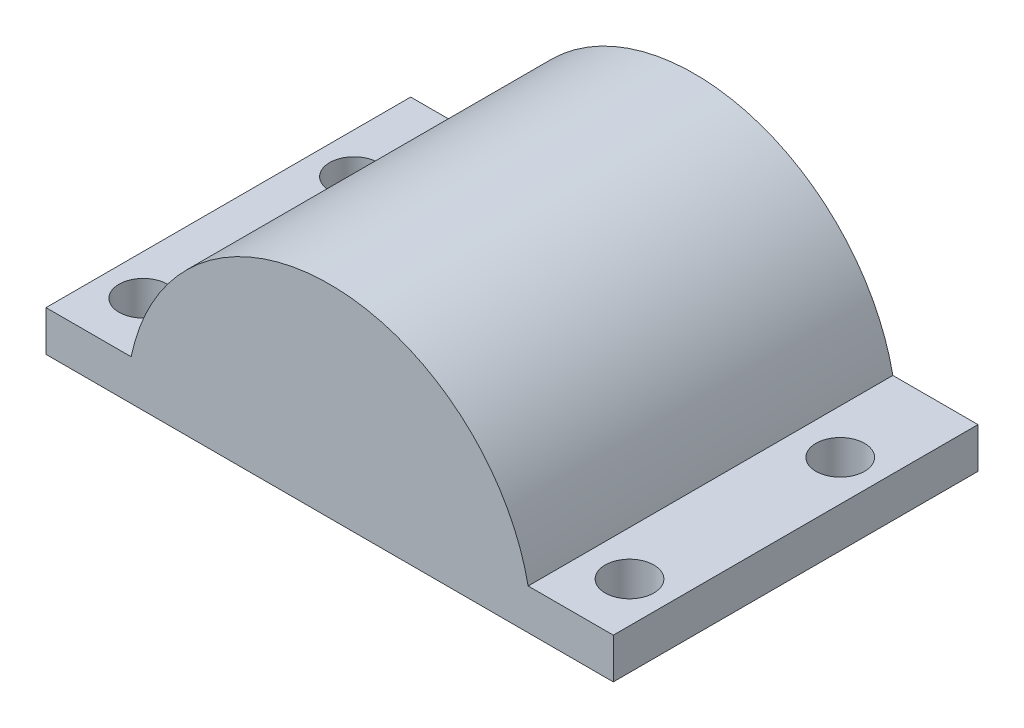
ISO-10303-21;
HEADER;
FILE_DESCRIPTION(('STEP AP214'),'2;1');
FILE_NAME('part.step','',(''),(''),'','','');
FILE_SCHEMA(('AUTOMOTIVE_DESIGN { 1 0 10303 214 1 1 1 1 }'));
ENDSEC;
DATA;
#1=APPLICATION_CONTEXT('core data for automotive mechanical design processes');
#2=APPLICATION_PROTOCOL_DEFINITION('international standard','automotive_design',2000,#1);
#3=PRODUCT_CONTEXT('',#1,'mechanical');
#4=PRODUCT('Part','Part','',(#3));
#5=PRODUCT_RELATED_PRODUCT_CATEGORY('part','',(#4));
#6=PRODUCT_DEFINITION_FORMATION('','',#4);
#7=PRODUCT_DEFINITION_CONTEXT('part definition',#1,'design');
#8=PRODUCT_DEFINITION('design','',#6,#7);
#9=PRODUCT_DEFINITION_SHAPE('','',#8);
#10=(LENGTH_UNIT() NAMED_UNIT(*) SI_UNIT(.MILLI.,.METRE.));
#11=(NAMED_UNIT(*) PLANE_ANGLE_UNIT() SI_UNIT($,.RADIAN.));
#12=(NAMED_UNIT(*) SI_UNIT($,.STERADIAN.) SOLID_ANGLE_UNIT());
#13=UNCERTAINTY_MEASURE_WITH_UNIT(LENGTH_MEASURE(1.E-05),#10,'distance_accuracy_value','');
#14=(GEOMETRIC_REPRESENTATION_CONTEXT(3) GLOBAL_UNCERTAINTY_ASSIGNED_CONTEXT((#13)) GLOBAL_UNIT_ASSIGNED_CONTEXT((#10,
#11,#12)) REPRESENTATION_CONTEXT('',''));
#15=CARTESIAN_POINT('',(0.,0.,0.));
#16=DIRECTION('',(0.,0.,1.));
#17=DIRECTION('',(1.,0.,0.));
#18=AXIS2_PLACEMENT_3D('',#15,#16,#17);
#19=CARTESIAN_POINT('',(-35.,30.,25.));
#20=DIRECTION('',(1.,0.,0.));
#21=DIRECTION('',(0.,0.,-1.));
#22=AXIS2_PLACEMENT_3D('',#19,#20,#21);
#23=PLANE('',#22);
#24=DIRECTION('',(0.,1.,0.));
#25=VECTOR('',#24,1.);
#26=CARTESIAN_POINT('',(-35.,0.,-20.));
#27=LINE('',#26,#25);
#28=CARTESIAN_POINT('',(-35.,0.,-20.));
#29=VERTEX_POINT('',#28);
#30=CARTESIAN_POINT('',(-35.,5.,-20.));
#31=VERTEX_POINT('',#30);
#32=EDGE_CURVE('E103',#29,#31,#27,.T.);
#33=ORIENTED_EDGE('',*,*,#32,.F.);
#34=DIRECTION('',(0.,0.,1.));
#35=VECTOR('',#34,1.);
#36=CARTESIAN_POINT('',(-35.,0.,25.));
#37=LINE('',#36,#35);
#38=CARTESIAN_POINT('',(-35.,0.,25.));
#39=VERTEX_POINT('',#38);
#40=EDGE_CURVE('E141',#29,#39,#37,.T.);
#41=ORIENTED_EDGE('',*,*,#40,.T.);
#42=DIRECTION('',(0.,-1.,0.));
#43=VECTOR('',#42,1.);
#44=CARTESIAN_POINT('',(-35.,30.,25.));
#45=LINE('',#44,#43);
#46=CARTESIAN_POINT('',(-35.,5.,25.));
#47=VERTEX_POINT('',#46);
#48=EDGE_CURVE('E125',#47,#39,#45,.T.);
#49=ORIENTED_EDGE('',*,*,#48,.F.);
#50=DIRECTION('',(0.,0.,1.));
#51=VECTOR('',#50,1.);
#52=CARTESIAN_POINT('',(-35.,5.,-25.));
#53=LINE('',#52,#51);
#54=EDGE_CURVE('E118',#31,#47,#53,.T.);
#55=ORIENTED_EDGE('',*,*,#54,.F.);
#56=EDGE_LOOP('',(#33,#41,#49,#55));
#57=FACE_BOUND('',#56,.T.);
#58=ADVANCED_FACE('F38',(#57),#23,.F.);
#59=CARTESIAN_POINT('',(35.,30.,25.));
#60=DIRECTION('',(-1.,0.,0.));
#61=DIRECTION('',(0.,0.,1.));
#62=AXIS2_PLACEMENT_3D('',#59,#60,#61);
#63=PLANE('',#62);
#64=DIRECTION('',(0.,-1.,0.));
#65=VECTOR('',#64,1.);
#66=CARTESIAN_POINT('',(35.,5.,-20.));
#67=LINE('',#66,#65);
#68=CARTESIAN_POINT('',(35.,5.,-20.));
#69=VERTEX_POINT('',#68);
#70=CARTESIAN_POINT('',(35.,0.,-20.));
#71=VERTEX_POINT('',#70);
#72=EDGE_CURVE('E217',#69,#71,#67,.T.);
#73=ORIENTED_EDGE('',*,*,#72,.F.);
#74=DIRECTION('',(0.,0.,1.));
#75=VECTOR('',#74,1.);
#76=CARTESIAN_POINT('',(35.,5.,-25.0000000000001));
#77=LINE('',#76,#75);
#78=CARTESIAN_POINT('',(35.,5.,25.));
#79=VERTEX_POINT('',#78);
#80=EDGE_CURVE('E127',#69,#79,#77,.T.);
#81=ORIENTED_EDGE('',*,*,#80,.T.);
#82=DIRECTION('',(0.,-1.,0.));
#83=VECTOR('',#82,1.);
#84=CARTESIAN_POINT('',(35.,30.,25.));
#85=LINE('',#84,#83);
#86=CARTESIAN_POINT('',(35.,0.,25.));
#87=VERTEX_POINT('',#86);
#88=EDGE_CURVE('E152',#79,#87,#85,.T.);
#89=ORIENTED_EDGE('',*,*,#88,.T.);
#90=DIRECTION('',(0.,0.,-1.));
#91=VECTOR('',#90,1.);
#92=CARTESIAN_POINT('',(35.,0.,25.));
#93=LINE('',#92,#91);
#94=EDGE_CURVE('E148',#87,#71,#93,.T.);
#95=ORIENTED_EDGE('',*,*,#94,.T.);
#96=EDGE_LOOP('',(#73,#81,#89,#95));
#97=FACE_BOUND('',#96,.T.);
#98=ADVANCED_FACE('F216',(#97),#63,.F.);
#99=CARTESIAN_POINT('',(0.,0.,0.));
#100=DIRECTION('',(0.,-1.,0.));
#101=DIRECTION('',(0.,0.,-1.));
#102=AXIS2_PLACEMENT_3D('',#99,#100,#101);
#103=PLANE('',#102);
#104=CARTESIAN_POINT('',(29.9999999999993,0.,-8.00000000000002));
#105=DIRECTION('',(0.,-1.,0.));
#106=DIRECTION('',(0.,0.,-1.));
#107=AXIS2_PLACEMENT_3D('',#104,#105,#106);
#108=CIRCLE('',#107,3.);
#109=CARTESIAN_POINT('',(29.9999999999993,0.,-11.));
#110=VERTEX_POINT('',#109);
#111=EDGE_CURVE('E230',#110,#110,#108,.T.);
#112=ORIENTED_EDGE('',*,*,#111,.F.);
#113=EDGE_LOOP('',(#112));
#114=FACE_BOUND('',#113,.T.);
#115=CARTESIAN_POINT('',(29.9999999999993,0.,18.));
#116=DIRECTION('',(0.,-1.,0.));
#117=DIRECTION('',(0.,0.,-1.));
#118=AXIS2_PLACEMENT_3D('',#115,#116,#117);
#119=CIRCLE('',#118,3.);
#120=CARTESIAN_POINT('',(29.9999999999993,0.,15.));
#121=VERTEX_POINT('',#120);
#122=EDGE_CURVE('E182',#121,#121,#119,.T.);
#123=ORIENTED_EDGE('',*,*,#122,.F.);
#124=EDGE_LOOP('',(#123));
#125=FACE_BOUND('',#124,.T.);
#126=CARTESIAN_POINT('',(-30.0000000000007,0.,-8.00000000000002));
#127=DIRECTION('',(0.,-1.,0.));
#128=DIRECTION('',(0.,0.,-1.));
#129=AXIS2_PLACEMENT_3D('',#126,#127,#128);
#130=CIRCLE('',#129,3.);
#131=CARTESIAN_POINT('',(-30.0000000000007,0.,-11.));
#132=VERTEX_POINT('',#131);
#133=EDGE_CURVE('E167',#132,#132,#130,.T.);
#134=ORIENTED_EDGE('',*,*,#133,.F.);
#135=EDGE_LOOP('',(#134));
#136=FACE_BOUND('',#135,.T.);
#137=CARTESIAN_POINT('',(-30.0000000000007,0.,18.));
#138=DIRECTION('',(0.,-1.,0.));
#139=DIRECTION('',(0.,0.,-1.));
#140=AXIS2_PLACEMENT_3D('',#137,#138,#139);
#141=CIRCLE('',#140,3.);
#142=CARTESIAN_POINT('',(-30.0000000000007,0.,15.));
#143=VERTEX_POINT('',#142);
#144=EDGE_CURVE('E166',#143,#143,#141,.T.);
#145=ORIENTED_EDGE('',*,*,#144,.F.);
#146=EDGE_LOOP('',(#145));
#147=FACE_BOUND('',#146,.T.);
#148=ORIENTED_EDGE('',*,*,#40,.F.);
#149=DIRECTION('',(-1.,0.,0.));
#150=VECTOR('',#149,1.);
#151=CARTESIAN_POINT('',(-10.0000000000009,0.,-20.));
#152=LINE('',#151,#150);
#153=CARTESIAN_POINT('',(-20.0000000000009,0.,-20.));
#154=VERTEX_POINT('',#153);
#155=EDGE_CURVE('E108',#154,#29,#152,.T.);
#156=ORIENTED_EDGE('',*,*,#155,.F.);
#157=DIRECTION('',(0.,0.,1.));
#158=VECTOR('',#157,1.);
#159=CARTESIAN_POINT('',(-20.0000000000009,0.,20.));
#160=LINE('',#159,#158);
#161=CARTESIAN_POINT('',(-20.0000000000009,0.,20.));
#162=VERTEX_POINT('',#161);
#163=EDGE_CURVE('E47',#154,#162,#160,.T.);
#164=ORIENTED_EDGE('',*,*,#163,.T.);
#165=DIRECTION('',(1.,0.,0.));
#166=VECTOR('',#165,1.);
#167=CARTESIAN_POINT('',(0.,0.,20.));
#168=LINE('',#167,#166);
#169=CARTESIAN_POINT('',(19.9999999999991,0.,20.));
#170=VERTEX_POINT('',#169);
#171=EDGE_CURVE('E157',#162,#170,#168,.T.);
#172=ORIENTED_EDGE('',*,*,#171,.T.);
#173=DIRECTION('',(0.,0.,1.));
#174=VECTOR('',#173,1.);
#175=CARTESIAN_POINT('',(19.9999999999991,0.,20.));
#176=LINE('',#175,#174);
#177=CARTESIAN_POINT('',(19.9999999999991,0.,-20.));
#178=VERTEX_POINT('',#177);
#179=EDGE_CURVE('E11',#170,#178,#176,.F.);
#180=ORIENTED_EDGE('',*,*,#179,.T.);
#181=DIRECTION('',(-1.,0.,0.));
#182=VECTOR('',#181,1.);
#183=CARTESIAN_POINT('',(35.,0.,-20.));
#184=LINE('',#183,#182);
#185=EDGE_CURVE('E220',#71,#178,#184,.T.);
#186=ORIENTED_EDGE('',*,*,#185,.F.);
#187=ORIENTED_EDGE('',*,*,#94,.F.);
#188=DIRECTION('',(1.,0.,0.));
#189=VECTOR('',#188,1.);
#190=CARTESIAN_POINT('',(-35.,0.,25.));
#191=LINE('',#190,#189);
#192=EDGE_CURVE('E144',#39,#87,#191,.T.);
#193=ORIENTED_EDGE('',*,*,#192,.F.);
#194=EDGE_LOOP('',(#148,#156,#164,#172,#180,#186,#187,#193));
#195=FACE_BOUND('',#194,.T.);
#196=ADVANCED_FACE('F265',(#114,#125,#136,#147,#195),#103,.T.);
#197=CARTESIAN_POINT('',(-9.00263120277727E-13,-3.33066907387545E-13,-25.));
#198=DIRECTION('',(0.,0.,1.));
#199=DIRECTION('',(1.,0.,0.));
#200=AXIS2_PLACEMENT_3D('',#197,#198,#199);
#201=CYLINDRICAL_SURFACE('',#200,24.9999999999991);
#202=CARTESIAN_POINT('',(-9.00263120277727E-13,-3.33066907387545E-13,-20.));
#203=DIRECTION('',(0.,0.,-1.));
#204=DIRECTION('',(-1.,0.,0.));
#205=AXIS2_PLACEMENT_3D('',#202,#203,#204);
#206=CIRCLE('',#205,24.9999999999987);
#207=CARTESIAN_POINT('',(-24.4948974278308,5.,-20.));
#208=VERTEX_POINT('',#207);
#209=CARTESIAN_POINT('',(24.4948974278308,5.,-20.));
#210=VERTEX_POINT('',#209);
#211=EDGE_CURVE('E55',#208,#210,#206,.T.);
#212=ORIENTED_EDGE('',*,*,#211,.F.);
#213=DIRECTION('',(0.,0.,1.));
#214=VECTOR('',#213,1.);
#215=CARTESIAN_POINT('',(-24.4948974278308,5.,-25.));
#216=LINE('',#215,#214);
#217=CARTESIAN_POINT('',(-24.4948974278308,5.,25.));
#218=VERTEX_POINT('',#217);
#219=EDGE_CURVE('E120',#208,#218,#216,.T.);
#220=ORIENTED_EDGE('',*,*,#219,.T.);
#221=CARTESIAN_POINT('',(-8.86835675191503E-13,-3.33066907387547E-13,25.));
#222=DIRECTION('',(0.,0.,-1.));
#223=DIRECTION('',(-1.,0.,0.));
#224=AXIS2_PLACEMENT_3D('',#221,#222,#223);
#225=CIRCLE('',#224,24.9999999999991);
#226=CARTESIAN_POINT('',(24.4948974278308,5.,25.));
#227=VERTEX_POINT('',#226);
#228=EDGE_CURVE('E189',#218,#227,#225,.T.);
#229=ORIENTED_EDGE('',*,*,#228,.T.);
#230=DIRECTION('',(0.,0.,1.));
#231=VECTOR('',#230,1.);
#232=CARTESIAN_POINT('',(24.4948974278308,5.,-25.));
#233=LINE('',#232,#231);
#234=EDGE_CURVE('E132',#210,#227,#233,.T.);
#235=ORIENTED_EDGE('',*,*,#234,.F.);
#236=EDGE_LOOP('',(#212,#220,#229,#235));
#237=FACE_BOUND('',#236,.T.);
#238=ADVANCED_FACE('F209',(#237),#201,.T.);
#239=CARTESIAN_POINT('',(0.,5.,-25.));
#240=DIRECTION('',(0.,1.,0.));
#241=DIRECTION('',(0.,0.,1.));
#242=AXIS2_PLACEMENT_3D('',#239,#240,#241);
#243=PLANE('',#242);
#244=CARTESIAN_POINT('',(-30.0000000000007,5.,-8.00000000000002));
#245=DIRECTION('',(0.,1.,0.));
#246=DIRECTION('',(0.,0.,1.));
#247=AXIS2_PLACEMENT_3D('',#244,#245,#246);
#248=CIRCLE('',#247,3.);
#249=CARTESIAN_POINT('',(-30.0000000000007,5.,-5.00000000000002));
#250=VERTEX_POINT('',#249);
#251=EDGE_CURVE('E163',#250,#250,#248,.T.);
#252=ORIENTED_EDGE('',*,*,#251,.F.);
#253=EDGE_LOOP('',(#252));
#254=FACE_BOUND('',#253,.T.);
#255=CARTESIAN_POINT('',(-30.0000000000007,5.,18.));
#256=DIRECTION('',(0.,1.,0.));
#257=DIRECTION('',(0.,0.,1.));
#258=AXIS2_PLACEMENT_3D('',#255,#256,#257);
#259=CIRCLE('',#258,3.);
#260=CARTESIAN_POINT('',(-30.0000000000007,5.,21.));
#261=VERTEX_POINT('',#260);
#262=EDGE_CURVE('E173',#261,#261,#259,.T.);
#263=ORIENTED_EDGE('',*,*,#262,.F.);
#264=EDGE_LOOP('',(#263));
#265=FACE_BOUND('',#264,.T.);
#266=ORIENTED_EDGE('',*,*,#219,.F.);
#267=DIRECTION('',(1.,0.,0.));
#268=VECTOR('',#267,1.);
#269=CARTESIAN_POINT('',(-35.,5.,-20.));
#270=LINE('',#269,#268);
#271=EDGE_CURVE('E106',#31,#208,#270,.T.);
#272=ORIENTED_EDGE('',*,*,#271,.F.);
#273=ORIENTED_EDGE('',*,*,#54,.T.);
#274=DIRECTION('',(-1.,0.,0.));
#275=VECTOR('',#274,1.);
#276=CARTESIAN_POINT('',(0.,5.,25.));
#277=LINE('',#276,#275);
#278=EDGE_CURVE('E193',#218,#47,#277,.T.);
#279=ORIENTED_EDGE('',*,*,#278,.F.);
#280=EDGE_LOOP('',(#266,#272,#273,#279));
#281=FACE_BOUND('',#280,.T.);
#282=ADVANCED_FACE('F116',(#254,#265,#281),#243,.T.);
#283=CARTESIAN_POINT('',(0.,5.,-25.));
#284=DIRECTION('',(0.,1.,0.));
#285=DIRECTION('',(0.,0.,1.));
#286=AXIS2_PLACEMENT_3D('',#283,#284,#285);
#287=PLANE('',#286);
#288=CARTESIAN_POINT('',(29.9999999999993,5.,-8.00000000000002));
#289=DIRECTION('',(0.,1.,0.));
#290=DIRECTION('',(0.,0.,1.));
#291=AXIS2_PLACEMENT_3D('',#288,#289,#290);
#292=CIRCLE('',#291,3.);
#293=CARTESIAN_POINT('',(29.9999999999993,5.,-5.00000000000002));
#294=VERTEX_POINT('',#293);
#295=EDGE_CURVE('E41',#294,#294,#292,.T.);
#296=ORIENTED_EDGE('',*,*,#295,.F.);
#297=EDGE_LOOP('',(#296));
#298=FACE_BOUND('',#297,.T.);
#299=CARTESIAN_POINT('',(29.9999999999993,5.,18.));
#300=DIRECTION('',(0.,1.,0.));
#301=DIRECTION('',(0.,0.,1.));
#302=AXIS2_PLACEMENT_3D('',#299,#300,#301);
#303=CIRCLE('',#302,3.);
#304=CARTESIAN_POINT('',(29.9999999999993,5.,21.));
#305=VERTEX_POINT('',#304);
#306=EDGE_CURVE('E176',#305,#305,#303,.T.);
#307=ORIENTED_EDGE('',*,*,#306,.F.);
#308=EDGE_LOOP('',(#307));
#309=FACE_BOUND('',#308,.T.);
#310=ORIENTED_EDGE('',*,*,#80,.F.);
#311=DIRECTION('',(1.,0.,0.));
#312=VECTOR('',#311,1.);
#313=CARTESIAN_POINT('',(24.49489742783,4.99999999999982,-20.));
#314=LINE('',#313,#312);
#315=EDGE_CURVE('E206',#210,#69,#314,.T.);
#316=ORIENTED_EDGE('',*,*,#315,.F.);
#317=ORIENTED_EDGE('',*,*,#234,.T.);
#318=DIRECTION('',(-1.,0.,0.));
#319=VECTOR('',#318,1.);
#320=CARTESIAN_POINT('',(0.,5.,25.));
#321=LINE('',#320,#319);
#322=EDGE_CURVE('E196',#79,#227,#321,.T.);
#323=ORIENTED_EDGE('',*,*,#322,.F.);
#324=EDGE_LOOP('',(#310,#316,#317,#323));
#325=FACE_BOUND('',#324,.T.);
#326=ADVANCED_FACE('F204',(#298,#309,#325),#287,.T.);
#327=CARTESIAN_POINT('',(-35.,30.,25.));
#328=DIRECTION('',(0.,0.,-1.));
#329=DIRECTION('',(-1.,0.,0.));
#330=AXIS2_PLACEMENT_3D('',#327,#328,#329);
#331=PLANE('',#330);
#332=ORIENTED_EDGE('',*,*,#278,.T.);
#333=ORIENTED_EDGE('',*,*,#48,.T.);
#334=ORIENTED_EDGE('',*,*,#192,.T.);
#335=ORIENTED_EDGE('',*,*,#88,.F.);
#336=ORIENTED_EDGE('',*,*,#322,.T.);
#337=ORIENTED_EDGE('',*,*,#228,.F.);
#338=EDGE_LOOP('',(#332,#333,#334,#335,#336,#337));
#339=FACE_BOUND('',#338,.T.);
#340=ADVANCED_FACE('F211',(#339),#331,.F.);
#341=CARTESIAN_POINT('',(-8.88178419700125E-13,-3.33066907387547E-13,20.));
#342=DIRECTION('',(0.,0.,1.));
#343=DIRECTION('',(-0.624365498000267,0.781132335079581,0.));
#344=AXIS2_PLACEMENT_3D('',#341,#342,#343);
#345=CYLINDRICAL_SURFACE('',#344,20.);
#346=CARTESIAN_POINT('',(-8.88178419700125E-13,-3.33066907387547E-13,20.));
#347=DIRECTION('',(0.,0.,1.));
#348=DIRECTION('',(-0.624365498000267,0.781132335079581,0.));
#349=AXIS2_PLACEMENT_3D('',#346,#347,#348);
#350=CIRCLE('',#349,20.);
#351=EDGE_CURVE('E62',#170,#162,#350,.T.);
#352=ORIENTED_EDGE('',*,*,#351,.T.);
#353=ORIENTED_EDGE('',*,*,#163,.F.);
#354=CARTESIAN_POINT('',(-8.98920375769105E-13,-3.33066907387545E-13,-20.));
#355=DIRECTION('',(0.,0.,1.));
#356=DIRECTION('',(-0.624365498000267,0.781132335079581,0.));
#357=AXIS2_PLACEMENT_3D('',#354,#355,#356);
#358=CIRCLE('',#357,20.);
#359=EDGE_CURVE('E138',#178,#154,#358,.T.);
#360=ORIENTED_EDGE('',*,*,#359,.F.);
#361=ORIENTED_EDGE('',*,*,#179,.F.);
#362=EDGE_LOOP('',(#352,#353,#360,#361));
#363=FACE_BOUND('',#362,.T.);
#364=ADVANCED_FACE('F274',(#363),#345,.F.);
#365=CARTESIAN_POINT('',(12.4873099600045,-15.622646701592,20.));
#366=DIRECTION('',(0.,0.,-1.));
#367=DIRECTION('',(0.624365498000267,-0.781132335079581,0.));
#368=AXIS2_PLACEMENT_3D('',#365,#366,#367);
#369=PLANE('',#368);
#370=ORIENTED_EDGE('',*,*,#351,.F.);
#371=ORIENTED_EDGE('',*,*,#171,.F.);
#372=EDGE_LOOP('',(#370,#371));
#373=FACE_BOUND('',#372,.T.);
#374=ADVANCED_FACE('F280',(#373),#369,.T.);
#375=CARTESIAN_POINT('',(-30.0000000000007,0.,18.));
#376=DIRECTION('',(0.,-1.,0.));
#377=DIRECTION('',(0.,0.,-1.));
#378=AXIS2_PLACEMENT_3D('',#375,#376,#377);
#379=CYLINDRICAL_SURFACE('',#378,3.);
#380=ORIENTED_EDGE('',*,*,#262,.T.);
#381=EDGE_LOOP('',(#380));
#382=FACE_BOUND('',#381,.T.);
#383=ORIENTED_EDGE('',*,*,#144,.T.);
#384=EDGE_LOOP('',(#383));
#385=FACE_BOUND('',#384,.T.);
#386=ADVANCED_FACE('F258',(#382,#385),#379,.F.);
#387=CARTESIAN_POINT('',(-30.0000000000007,0.,-8.00000000000002));
#388=DIRECTION('',(0.,-1.,0.));
#389=DIRECTION('',(0.,0.,-1.));
#390=AXIS2_PLACEMENT_3D('',#387,#388,#389);
#391=CYLINDRICAL_SURFACE('',#390,3.);
#392=ORIENTED_EDGE('',*,*,#251,.T.);
#393=EDGE_LOOP('',(#392));
#394=FACE_BOUND('',#393,.T.);
#395=ORIENTED_EDGE('',*,*,#133,.T.);
#396=EDGE_LOOP('',(#395));
#397=FACE_BOUND('',#396,.T.);
#398=ADVANCED_FACE('F251',(#394,#397),#391,.F.);
#399=CARTESIAN_POINT('',(29.9999999999993,0.,18.));
#400=DIRECTION('',(0.,-1.,0.));
#401=DIRECTION('',(0.,0.,-1.));
#402=AXIS2_PLACEMENT_3D('',#399,#400,#401);
#403=CYLINDRICAL_SURFACE('',#402,3.);
#404=ORIENTED_EDGE('',*,*,#306,.T.);
#405=EDGE_LOOP('',(#404));
#406=FACE_BOUND('',#405,.T.);
#407=ORIENTED_EDGE('',*,*,#122,.T.);
#408=EDGE_LOOP('',(#407));
#409=FACE_BOUND('',#408,.T.);
#410=ADVANCED_FACE('F249',(#406,#409),#403,.F.);
#411=CARTESIAN_POINT('',(29.9999999999993,0.,-8.00000000000002));
#412=DIRECTION('',(0.,-1.,0.));
#413=DIRECTION('',(0.,0.,-1.));
#414=AXIS2_PLACEMENT_3D('',#411,#412,#413);
#415=CYLINDRICAL_SURFACE('',#414,3.);
#416=ORIENTED_EDGE('',*,*,#295,.T.);
#417=EDGE_LOOP('',(#416));
#418=FACE_BOUND('',#417,.T.);
#419=ORIENTED_EDGE('',*,*,#111,.T.);
#420=EDGE_LOOP('',(#419));
#421=FACE_BOUND('',#420,.T.);
#422=ADVANCED_FACE('F241',(#418,#421),#415,.F.);
#423=CARTESIAN_POINT('',(-9.00263120277727E-13,-3.33066907387545E-13,-20.));
#424=DIRECTION('',(0.,0.,-1.));
#425=DIRECTION('',(-1.,0.,0.));
#426=AXIS2_PLACEMENT_3D('',#423,#424,#425);
#427=PLANE('',#426);
#428=ORIENTED_EDGE('',*,*,#155,.T.);
#429=ORIENTED_EDGE('',*,*,#32,.T.);
#430=ORIENTED_EDGE('',*,*,#271,.T.);
#431=ORIENTED_EDGE('',*,*,#211,.T.);
#432=ORIENTED_EDGE('',*,*,#315,.T.);
#433=ORIENTED_EDGE('',*,*,#72,.T.);
#434=ORIENTED_EDGE('',*,*,#185,.T.);
#435=ORIENTED_EDGE('',*,*,#359,.T.);
#436=EDGE_LOOP('',(#428,#429,#430,#431,#432,#433,#434,#435));
#437=FACE_BOUND('',#436,.T.);
#438=ADVANCED_FACE('F105',(#437),#427,.T.);
#439=CLOSED_SHELL('',(#58,#98,#196,#238,#282,#326,#340,#364,#374,#386,#398,#410,#422,#438));
#440=MANIFOLD_SOLID_BREP('B2',#439);
#441=ADVANCED_BREP_SHAPE_REPRESENTATION('',(#18,#440),#14);
#442=SHAPE_DEFINITION_REPRESENTATION(#9,#441);
ENDSEC;
END-ISO-10303-21;
